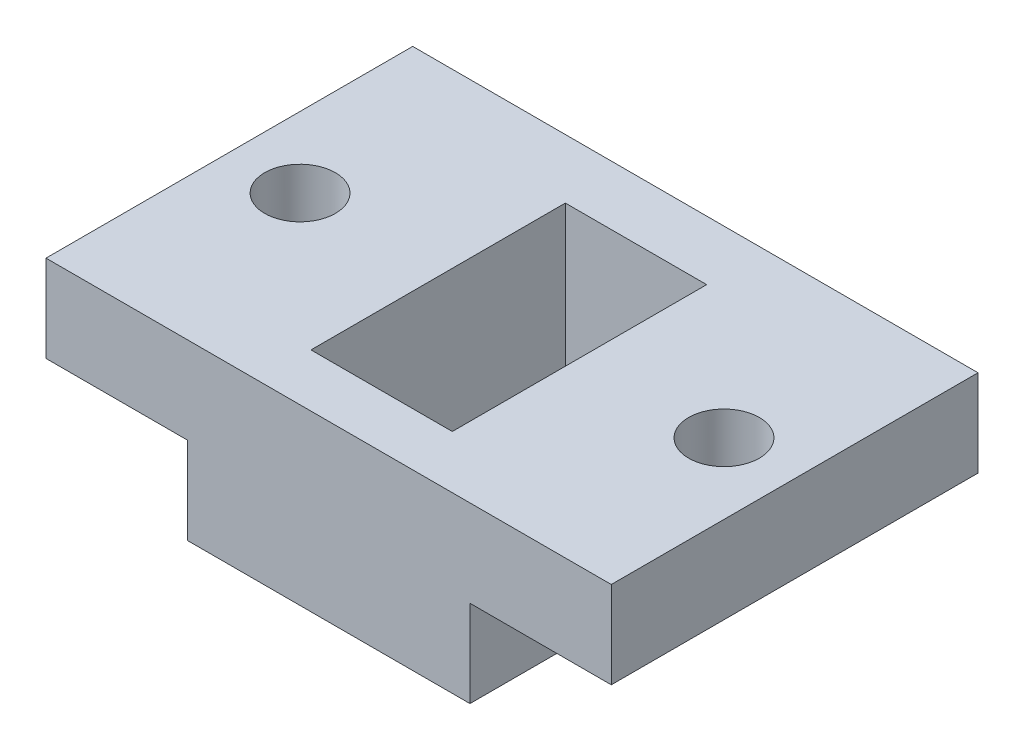
ISO-10303-21;
HEADER;
FILE_DESCRIPTION(('STEP AP214'),'2;1');
FILE_NAME('part.step','',(''),(''),'','','');
FILE_SCHEMA(('AUTOMOTIVE_DESIGN { 1 0 10303 214 1 1 1 1 }'));
ENDSEC;
DATA;
#1=APPLICATION_CONTEXT('core data for automotive mechanical design processes');
#2=APPLICATION_PROTOCOL_DEFINITION('international standard','automotive_design',2000,#1);
#3=PRODUCT_CONTEXT('',#1,'mechanical');
#4=PRODUCT('Part','Part','',(#3));
#5=PRODUCT_RELATED_PRODUCT_CATEGORY('part','',(#4));
#6=PRODUCT_DEFINITION_FORMATION('','',#4);
#7=PRODUCT_DEFINITION_CONTEXT('part definition',#1,'design');
#8=PRODUCT_DEFINITION('design','',#6,#7);
#9=PRODUCT_DEFINITION_SHAPE('','',#8);
#10=(LENGTH_UNIT() NAMED_UNIT(*) SI_UNIT(.MILLI.,.METRE.));
#11=(NAMED_UNIT(*) PLANE_ANGLE_UNIT() SI_UNIT($,.RADIAN.));
#12=(NAMED_UNIT(*) SI_UNIT($,.STERADIAN.) SOLID_ANGLE_UNIT());
#13=UNCERTAINTY_MEASURE_WITH_UNIT(LENGTH_MEASURE(1.E-05),#10,'distance_accuracy_value','');
#14=(GEOMETRIC_REPRESENTATION_CONTEXT(3) GLOBAL_UNCERTAINTY_ASSIGNED_CONTEXT((#13)) GLOBAL_UNIT_ASSIGNED_CONTEXT((#10,
#11,#12)) REPRESENTATION_CONTEXT('',''));
#15=CARTESIAN_POINT('',(0.,0.,0.));
#16=DIRECTION('',(0.,0.,1.));
#17=DIRECTION('',(1.,0.,0.));
#18=AXIS2_PLACEMENT_3D('',#15,#16,#17);
#19=CARTESIAN_POINT('',(12.7,7.8105,12.7));
#20=DIRECTION('',(-1.,0.,0.));
#21=DIRECTION('',(0.,-1.,0.));
#22=AXIS2_PLACEMENT_3D('',#19,#20,#21);
#23=PLANE('',#22);
#24=DIRECTION('',(0.,0.,-1.));
#25=VECTOR('',#24,1.);
#26=CARTESIAN_POINT('',(12.7,0.,4.7625));
#27=LINE('',#26,#25);
#28=CARTESIAN_POINT('',(12.7,0.,4.7625));
#29=VERTEX_POINT('',#28);
#30=CARTESIAN_POINT('',(12.7,0.,-28.194));
#31=VERTEX_POINT('',#30);
#32=EDGE_CURVE('E55',#29,#31,#27,.T.);
#33=ORIENTED_EDGE('',*,*,#32,.F.);
#34=DIRECTION('',(0.,1.,0.));
#35=VECTOR('',#34,1.);
#36=CARTESIAN_POINT('',(12.7,-7.9375,4.7625));
#37=LINE('',#36,#35);
#38=CARTESIAN_POINT('',(12.7,-7.8105,4.7625));
#39=VERTEX_POINT('',#38);
#40=EDGE_CURVE('E152',#39,#29,#37,.T.);
#41=ORIENTED_EDGE('',*,*,#40,.F.);
#42=DIRECTION('',(0.,0.,-1.));
#43=VECTOR('',#42,1.);
#44=CARTESIAN_POINT('',(12.7,-7.8105,12.7));
#45=LINE('',#44,#43);
#46=CARTESIAN_POINT('',(12.7,-7.8105,-28.194));
#47=VERTEX_POINT('',#46);
#48=EDGE_CURVE('E220',#39,#47,#45,.T.);
#49=ORIENTED_EDGE('',*,*,#48,.T.);
#50=DIRECTION('',(0.,-1.,0.));
#51=VECTOR('',#50,1.);
#52=CARTESIAN_POINT('',(12.7,7.8105,-28.194));
#53=LINE('',#52,#51);
#54=EDGE_CURVE('E176',#31,#47,#53,.T.);
#55=ORIENTED_EDGE('',*,*,#54,.F.);
#56=EDGE_LOOP('',(#33,#41,#49,#55));
#57=FACE_BOUND('',#56,.T.);
#58=ADVANCED_FACE('F41',(#57),#23,.F.);
#59=CARTESIAN_POINT('',(-12.7,7.8105,12.7));
#60=DIRECTION('',(1.,0.,0.));
#61=DIRECTION('',(0.,1.,0.));
#62=AXIS2_PLACEMENT_3D('',#59,#60,#61);
#63=PLANE('',#62);
#64=DIRECTION('',(0.,0.,1.));
#65=VECTOR('',#64,1.);
#66=CARTESIAN_POINT('',(-12.7,0.,-28.194));
#67=LINE('',#66,#65);
#68=CARTESIAN_POINT('',(-12.7,0.,-28.194));
#69=VERTEX_POINT('',#68);
#70=CARTESIAN_POINT('',(-12.7,0.,4.7625));
#71=VERTEX_POINT('',#70);
#72=EDGE_CURVE('E63',#69,#71,#67,.T.);
#73=ORIENTED_EDGE('',*,*,#72,.F.);
#74=DIRECTION('',(0.,1.,0.));
#75=VECTOR('',#74,1.);
#76=CARTESIAN_POINT('',(-12.7,7.8105,-28.194));
#77=LINE('',#76,#75);
#78=CARTESIAN_POINT('',(-12.7,-7.8105,-28.194));
#79=VERTEX_POINT('',#78);
#80=EDGE_CURVE('E182',#79,#69,#77,.T.);
#81=ORIENTED_EDGE('',*,*,#80,.F.);
#82=DIRECTION('',(0.,0.,-1.));
#83=VECTOR('',#82,1.);
#84=CARTESIAN_POINT('',(-12.7,-7.8105,12.7));
#85=LINE('',#84,#83);
#86=CARTESIAN_POINT('',(-12.7,-7.8105,4.7625));
#87=VERTEX_POINT('',#86);
#88=EDGE_CURVE('E48',#87,#79,#85,.T.);
#89=ORIENTED_EDGE('',*,*,#88,.F.);
#90=DIRECTION('',(0.,1.,0.));
#91=VECTOR('',#90,1.);
#92=CARTESIAN_POINT('',(-12.7,-7.9375,4.7625));
#93=LINE('',#92,#91);
#94=EDGE_CURVE('E192',#87,#71,#93,.T.);
#95=ORIENTED_EDGE('',*,*,#94,.T.);
#96=EDGE_LOOP('',(#73,#81,#89,#95));
#97=FACE_BOUND('',#96,.T.);
#98=ADVANCED_FACE('F231',(#97),#63,.F.);
#99=CARTESIAN_POINT('',(0.,0.,0.));
#100=DIRECTION('',(0.,0.,1.));
#101=DIRECTION('',(1.,0.,0.));
#102=AXIS2_PLACEMENT_3D('',#99,#100,#101);
#103=PLANE('',#102);
#104=DIRECTION('',(0.,1.,0.));
#105=VECTOR('',#104,1.);
#106=CARTESIAN_POINT('',(6.35,0.,0.));
#107=LINE('',#106,#105);
#108=CARTESIAN_POINT('',(6.35,-7.8105,0.));
#109=VERTEX_POINT('',#108);
#110=CARTESIAN_POINT('',(6.35,7.8105,0.));
#111=VERTEX_POINT('',#110);
#112=EDGE_CURVE('E194',#109,#111,#107,.T.);
#113=ORIENTED_EDGE('',*,*,#112,.F.);
#114=DIRECTION('',(1.,0.,0.));
#115=VECTOR('',#114,1.);
#116=CARTESIAN_POINT('',(-12.7,-7.8105,0.));
#117=LINE('',#116,#115);
#118=CARTESIAN_POINT('',(-6.35,-7.8105,0.));
#119=VERTEX_POINT('',#118);
#120=EDGE_CURVE('E217',#119,#109,#117,.T.);
#121=ORIENTED_EDGE('',*,*,#120,.F.);
#122=DIRECTION('',(0.,1.,0.));
#123=VECTOR('',#122,1.);
#124=CARTESIAN_POINT('',(-6.35,0.,0.));
#125=LINE('',#124,#123);
#126=CARTESIAN_POINT('',(-6.35,7.8105,0.));
#127=VERTEX_POINT('',#126);
#128=EDGE_CURVE('E205',#119,#127,#125,.T.);
#129=ORIENTED_EDGE('',*,*,#128,.T.);
#130=DIRECTION('',(-1.,0.,0.));
#131=VECTOR('',#130,1.);
#132=CARTESIAN_POINT('',(-12.7,7.8105,0.));
#133=LINE('',#132,#131);
#134=EDGE_CURVE('E215',#111,#127,#133,.T.);
#135=ORIENTED_EDGE('',*,*,#134,.F.);
#136=EDGE_LOOP('',(#113,#121,#129,#135));
#137=FACE_BOUND('',#136,.T.);
#138=ADVANCED_FACE('F233',(#137),#103,.F.);
#139=CARTESIAN_POINT('',(-12.7,7.8105,12.7));
#140=DIRECTION('',(0.,-1.,0.));
#141=DIRECTION('',(0.,0.,-1.));
#142=AXIS2_PLACEMENT_3D('',#139,#140,#141);
#143=PLANE('',#142);
#144=CARTESIAN_POINT('',(-19.05,7.8105,-11.71575));
#145=DIRECTION('',(0.,-1.,0.));
#146=DIRECTION('',(0.,0.,-1.));
#147=AXIS2_PLACEMENT_3D('',#144,#145,#146);
#148=CIRCLE('',#147,3.175);
#149=CARTESIAN_POINT('',(-19.05,7.8105,-14.89075));
#150=VERTEX_POINT('',#149);
#151=EDGE_CURVE('E256',#150,#150,#148,.T.);
#152=ORIENTED_EDGE('',*,*,#151,.T.);
#153=EDGE_LOOP('',(#152));
#154=FACE_BOUND('',#153,.T.);
#155=CARTESIAN_POINT('',(19.05,7.8105,-11.71575));
#156=DIRECTION('',(0.,-1.,0.));
#157=DIRECTION('',(0.,0.,-1.));
#158=AXIS2_PLACEMENT_3D('',#155,#156,#157);
#159=CIRCLE('',#158,3.175);
#160=CARTESIAN_POINT('',(19.05,7.8105,-14.89075));
#161=VERTEX_POINT('',#160);
#162=EDGE_CURVE('E260',#161,#161,#159,.T.);
#163=ORIENTED_EDGE('',*,*,#162,.T.);
#164=EDGE_LOOP('',(#163));
#165=FACE_BOUND('',#164,.T.);
#166=DIRECTION('',(0.,0.,1.));
#167=VECTOR('',#166,1.);
#168=CARTESIAN_POINT('',(-6.35,7.8105,-22.86));
#169=LINE('',#168,#167);
#170=CARTESIAN_POINT('',(-6.35,7.8105,-22.86));
#171=VERTEX_POINT('',#170);
#172=EDGE_CURVE('E208',#171,#127,#169,.T.);
#173=ORIENTED_EDGE('',*,*,#172,.F.);
#174=DIRECTION('',(1.,0.,0.));
#175=VECTOR('',#174,1.);
#176=CARTESIAN_POINT('',(12.7,7.8105,-22.86));
#177=LINE('',#176,#175);
#178=CARTESIAN_POINT('',(6.35,7.8105,-22.86));
#179=VERTEX_POINT('',#178);
#180=EDGE_CURVE('E179',#171,#179,#177,.T.);
#181=ORIENTED_EDGE('',*,*,#180,.T.);
#182=DIRECTION('',(0.,0.,1.));
#183=VECTOR('',#182,1.);
#184=CARTESIAN_POINT('',(6.35,7.8105,-22.86));
#185=LINE('',#184,#183);
#186=EDGE_CURVE('E199',#179,#111,#185,.T.);
#187=ORIENTED_EDGE('',*,*,#186,.T.);
#188=ORIENTED_EDGE('',*,*,#134,.T.);
#189=EDGE_LOOP('',(#173,#181,#187,#188));
#190=FACE_BOUND('',#189,.T.);
#191=DIRECTION('',(1.,0.,0.));
#192=VECTOR('',#191,1.);
#193=CARTESIAN_POINT('',(12.7,7.8105,-28.194));
#194=LINE('',#193,#192);
#195=CARTESIAN_POINT('',(-25.4,7.8105,-28.194));
#196=VERTEX_POINT('',#195);
#197=CARTESIAN_POINT('',(25.4,7.8105,-28.194));
#198=VERTEX_POINT('',#197);
#199=EDGE_CURVE('E184',#196,#198,#194,.T.);
#200=ORIENTED_EDGE('',*,*,#199,.F.);
#201=DIRECTION('',(0.,0.,-1.));
#202=VECTOR('',#201,1.);
#203=CARTESIAN_POINT('',(-25.4,7.8105,-28.194));
#204=LINE('',#203,#202);
#205=CARTESIAN_POINT('',(-25.4,7.8105,4.7625));
#206=VERTEX_POINT('',#205);
#207=EDGE_CURVE('E166',#206,#196,#204,.T.);
#208=ORIENTED_EDGE('',*,*,#207,.F.);
#209=DIRECTION('',(-1.,0.,0.));
#210=VECTOR('',#209,1.);
#211=CARTESIAN_POINT('',(-12.7,7.8105,4.7625));
#212=LINE('',#211,#210);
#213=CARTESIAN_POINT('',(25.4,7.8105,4.7625));
#214=VERTEX_POINT('',#213);
#215=EDGE_CURVE('E186',#214,#206,#212,.T.);
#216=ORIENTED_EDGE('',*,*,#215,.F.);
#217=DIRECTION('',(0.,0.,1.));
#218=VECTOR('',#217,1.);
#219=CARTESIAN_POINT('',(25.4,7.8105,4.7625));
#220=LINE('',#219,#218);
#221=EDGE_CURVE('E148',#198,#214,#220,.T.);
#222=ORIENTED_EDGE('',*,*,#221,.F.);
#223=EDGE_LOOP('',(#200,#208,#216,#222));
#224=FACE_BOUND('',#223,.T.);
#225=ADVANCED_FACE('F240',(#154,#165,#190,#224),#143,.F.);
#226=CARTESIAN_POINT('',(-12.7,-7.8105,12.7));
#227=DIRECTION('',(0.,1.,0.));
#228=DIRECTION('',(0.,0.,1.));
#229=AXIS2_PLACEMENT_3D('',#226,#227,#228);
#230=PLANE('',#229);
#231=ORIENTED_EDGE('',*,*,#88,.T.);
#232=DIRECTION('',(-1.,0.,0.));
#233=VECTOR('',#232,1.);
#234=CARTESIAN_POINT('',(12.7,-7.8105,-28.194));
#235=LINE('',#234,#233);
#236=EDGE_CURVE('E178',#47,#79,#235,.T.);
#237=ORIENTED_EDGE('',*,*,#236,.F.);
#238=ORIENTED_EDGE('',*,*,#48,.F.);
#239=DIRECTION('',(-1.,0.,0.));
#240=VECTOR('',#239,1.);
#241=CARTESIAN_POINT('',(-12.7,-7.8105,4.7625));
#242=LINE('',#241,#240);
#243=EDGE_CURVE('E11',#39,#87,#242,.T.);
#244=ORIENTED_EDGE('',*,*,#243,.T.);
#245=EDGE_LOOP('',(#231,#237,#238,#244));
#246=FACE_BOUND('',#245,.T.);
#247=DIRECTION('',(-1.,0.,0.));
#248=VECTOR('',#247,1.);
#249=CARTESIAN_POINT('',(12.7,-7.8105,-22.86));
#250=LINE('',#249,#248);
#251=CARTESIAN_POINT('',(6.35,-7.8105,-22.86));
#252=VERTEX_POINT('',#251);
#253=CARTESIAN_POINT('',(-6.35,-7.8105,-22.86));
#254=VERTEX_POINT('',#253);
#255=EDGE_CURVE('E175',#252,#254,#250,.T.);
#256=ORIENTED_EDGE('',*,*,#255,.T.);
#257=DIRECTION('',(0.,0.,1.));
#258=VECTOR('',#257,1.);
#259=CARTESIAN_POINT('',(-6.35,-7.8105,-22.86));
#260=LINE('',#259,#258);
#261=EDGE_CURVE('E213',#254,#119,#260,.T.);
#262=ORIENTED_EDGE('',*,*,#261,.T.);
#263=ORIENTED_EDGE('',*,*,#120,.T.);
#264=DIRECTION('',(0.,0.,1.));
#265=VECTOR('',#264,1.);
#266=CARTESIAN_POINT('',(6.35,-7.8105,-22.86));
#267=LINE('',#266,#265);
#268=EDGE_CURVE('E203',#252,#109,#267,.T.);
#269=ORIENTED_EDGE('',*,*,#268,.F.);
#270=EDGE_LOOP('',(#256,#262,#263,#269));
#271=FACE_BOUND('',#270,.T.);
#272=ADVANCED_FACE('F225',(#246,#271),#230,.F.);
#273=CARTESIAN_POINT('',(-6.35,0.,-22.86));
#274=DIRECTION('',(1.,0.,0.));
#275=DIRECTION('',(0.,0.,-1.));
#276=AXIS2_PLACEMENT_3D('',#273,#274,#275);
#277=PLANE('',#276);
#278=ORIENTED_EDGE('',*,*,#128,.F.);
#279=ORIENTED_EDGE('',*,*,#261,.F.);
#280=DIRECTION('',(0.,1.,0.));
#281=VECTOR('',#280,1.);
#282=CARTESIAN_POINT('',(-6.35,0.,-22.86));
#283=LINE('',#282,#281);
#284=EDGE_CURVE('E206',#254,#171,#283,.T.);
#285=ORIENTED_EDGE('',*,*,#284,.T.);
#286=ORIENTED_EDGE('',*,*,#172,.T.);
#287=EDGE_LOOP('',(#278,#279,#285,#286));
#288=FACE_BOUND('',#287,.T.);
#289=ADVANCED_FACE('F252',(#288),#277,.T.);
#290=CARTESIAN_POINT('',(6.35,0.,-22.86));
#291=DIRECTION('',(1.,0.,0.));
#292=DIRECTION('',(0.,0.,-1.));
#293=AXIS2_PLACEMENT_3D('',#290,#291,#292);
#294=PLANE('',#293);
#295=ORIENTED_EDGE('',*,*,#112,.T.);
#296=ORIENTED_EDGE('',*,*,#186,.F.);
#297=DIRECTION('',(0.,1.,0.));
#298=VECTOR('',#297,1.);
#299=CARTESIAN_POINT('',(6.35,0.,-22.86));
#300=LINE('',#299,#298);
#301=EDGE_CURVE('E196',#252,#179,#300,.T.);
#302=ORIENTED_EDGE('',*,*,#301,.F.);
#303=ORIENTED_EDGE('',*,*,#268,.T.);
#304=EDGE_LOOP('',(#295,#296,#302,#303));
#305=FACE_BOUND('',#304,.T.);
#306=ADVANCED_FACE('F301',(#305),#294,.F.);
#307=CARTESIAN_POINT('',(-12.7,-7.9375,4.7625));
#308=DIRECTION('',(0.,0.,-1.));
#309=DIRECTION('',(-1.,0.,0.));
#310=AXIS2_PLACEMENT_3D('',#307,#308,#309);
#311=PLANE('',#310);
#312=ORIENTED_EDGE('',*,*,#40,.T.);
#313=DIRECTION('',(-1.,0.,0.));
#314=VECTOR('',#313,1.);
#315=CARTESIAN_POINT('',(25.4,0.,4.7625));
#316=LINE('',#315,#314);
#317=CARTESIAN_POINT('',(25.4,0.,4.7625));
#318=VERTEX_POINT('',#317);
#319=EDGE_CURVE('E135',#318,#29,#316,.T.);
#320=ORIENTED_EDGE('',*,*,#319,.F.);
#321=DIRECTION('',(0.,-1.,0.));
#322=VECTOR('',#321,1.);
#323=CARTESIAN_POINT('',(25.4,7.8105,4.7625));
#324=LINE('',#323,#322);
#325=EDGE_CURVE('E142',#214,#318,#324,.T.);
#326=ORIENTED_EDGE('',*,*,#325,.F.);
#327=ORIENTED_EDGE('',*,*,#215,.T.);
#328=DIRECTION('',(0.,1.,0.));
#329=VECTOR('',#328,1.);
#330=CARTESIAN_POINT('',(-25.4,7.8105,4.7625));
#331=LINE('',#330,#329);
#332=CARTESIAN_POINT('',(-25.4,0.,4.7625));
#333=VERTEX_POINT('',#332);
#334=EDGE_CURVE('E163',#333,#206,#331,.T.);
#335=ORIENTED_EDGE('',*,*,#334,.F.);
#336=DIRECTION('',(1.,0.,0.));
#337=VECTOR('',#336,1.);
#338=CARTESIAN_POINT('',(-25.4,0.,4.7625));
#339=LINE('',#338,#337);
#340=EDGE_CURVE('E168',#333,#71,#339,.T.);
#341=ORIENTED_EDGE('',*,*,#340,.T.);
#342=ORIENTED_EDGE('',*,*,#94,.F.);
#343=ORIENTED_EDGE('',*,*,#243,.F.);
#344=EDGE_LOOP('',(#312,#320,#326,#327,#335,#341,#342,#343));
#345=FACE_BOUND('',#344,.T.);
#346=ADVANCED_FACE('F151',(#345),#311,.F.);
#347=CARTESIAN_POINT('',(0.,0.,-22.86));
#348=DIRECTION('',(0.,0.,-1.));
#349=DIRECTION('',(-1.,0.,0.));
#350=AXIS2_PLACEMENT_3D('',#347,#348,#349);
#351=PLANE('',#350);
#352=ORIENTED_EDGE('',*,*,#284,.F.);
#353=ORIENTED_EDGE('',*,*,#255,.F.);
#354=ORIENTED_EDGE('',*,*,#301,.T.);
#355=ORIENTED_EDGE('',*,*,#180,.F.);
#356=EDGE_LOOP('',(#352,#353,#354,#355));
#357=FACE_BOUND('',#356,.T.);
#358=ADVANCED_FACE('F293',(#357),#351,.F.);
#359=CARTESIAN_POINT('',(0.,0.,-28.194));
#360=DIRECTION('',(0.,0.,-1.));
#361=DIRECTION('',(-1.,0.,0.));
#362=AXIS2_PLACEMENT_3D('',#359,#360,#361);
#363=PLANE('',#362);
#364=ORIENTED_EDGE('',*,*,#199,.T.);
#365=DIRECTION('',(0.,1.,0.));
#366=VECTOR('',#365,1.);
#367=CARTESIAN_POINT('',(25.4,7.8105,-28.194));
#368=LINE('',#367,#366);
#369=CARTESIAN_POINT('',(25.4,0.,-28.194));
#370=VERTEX_POINT('',#369);
#371=EDGE_CURVE('E141',#370,#198,#368,.T.);
#372=ORIENTED_EDGE('',*,*,#371,.F.);
#373=DIRECTION('',(-1.,0.,0.));
#374=VECTOR('',#373,1.);
#375=CARTESIAN_POINT('',(25.4,0.,-28.194));
#376=LINE('',#375,#374);
#377=EDGE_CURVE('E137',#370,#31,#376,.T.);
#378=ORIENTED_EDGE('',*,*,#377,.T.);
#379=ORIENTED_EDGE('',*,*,#54,.T.);
#380=ORIENTED_EDGE('',*,*,#236,.T.);
#381=ORIENTED_EDGE('',*,*,#80,.T.);
#382=DIRECTION('',(1.,0.,0.));
#383=VECTOR('',#382,1.);
#384=CARTESIAN_POINT('',(-25.4,0.,-28.194));
#385=LINE('',#384,#383);
#386=CARTESIAN_POINT('',(-25.4,0.,-28.194));
#387=VERTEX_POINT('',#386);
#388=EDGE_CURVE('E172',#387,#69,#385,.T.);
#389=ORIENTED_EDGE('',*,*,#388,.F.);
#390=DIRECTION('',(0.,-1.,0.));
#391=VECTOR('',#390,1.);
#392=CARTESIAN_POINT('',(-25.4,7.8105,-28.194));
#393=LINE('',#392,#391);
#394=EDGE_CURVE('E154',#196,#387,#393,.T.);
#395=ORIENTED_EDGE('',*,*,#394,.F.);
#396=EDGE_LOOP('',(#364,#372,#378,#379,#380,#381,#389,#395));
#397=FACE_BOUND('',#396,.T.);
#398=ADVANCED_FACE('F229',(#397),#363,.T.);
#399=CARTESIAN_POINT('',(-25.4,0.,-28.194));
#400=DIRECTION('',(0.,1.,0.));
#401=DIRECTION('',(-1.,0.,0.));
#402=AXIS2_PLACEMENT_3D('',#399,#400,#401);
#403=PLANE('',#402);
#404=CARTESIAN_POINT('',(-19.05,0.,-11.71575));
#405=DIRECTION('',(0.,-1.,0.));
#406=DIRECTION('',(1.,0.,0.));
#407=AXIS2_PLACEMENT_3D('',#404,#405,#406);
#408=CIRCLE('',#407,3.175);
#409=CARTESIAN_POINT('',(-15.875,0.,-11.71575));
#410=VERTEX_POINT('',#409);
#411=EDGE_CURVE('E277',#410,#410,#408,.T.);
#412=ORIENTED_EDGE('',*,*,#411,.F.);
#413=EDGE_LOOP('',(#412));
#414=FACE_BOUND('',#413,.T.);
#415=ORIENTED_EDGE('',*,*,#72,.T.);
#416=ORIENTED_EDGE('',*,*,#340,.F.);
#417=DIRECTION('',(0.,0.,1.));
#418=VECTOR('',#417,1.);
#419=CARTESIAN_POINT('',(-25.4,0.,-28.194));
#420=LINE('',#419,#418);
#421=EDGE_CURVE('E161',#387,#333,#420,.T.);
#422=ORIENTED_EDGE('',*,*,#421,.F.);
#423=ORIENTED_EDGE('',*,*,#388,.T.);
#424=EDGE_LOOP('',(#415,#416,#422,#423));
#425=FACE_BOUND('',#424,.T.);
#426=ADVANCED_FACE('F270',(#414,#425),#403,.F.);
#427=CARTESIAN_POINT('',(-25.4,0.,0.));
#428=DIRECTION('',(-1.,0.,0.));
#429=DIRECTION('',(0.,-1.,0.));
#430=AXIS2_PLACEMENT_3D('',#427,#428,#429);
#431=PLANE('',#430);
#432=ORIENTED_EDGE('',*,*,#394,.T.);
#433=ORIENTED_EDGE('',*,*,#421,.T.);
#434=ORIENTED_EDGE('',*,*,#334,.T.);
#435=ORIENTED_EDGE('',*,*,#207,.T.);
#436=EDGE_LOOP('',(#432,#433,#434,#435));
#437=FACE_BOUND('',#436,.T.);
#438=ADVANCED_FACE('F267',(#437),#431,.T.);
#439=CARTESIAN_POINT('',(25.4,0.,4.7625));
#440=DIRECTION('',(0.,1.,0.));
#441=DIRECTION('',(-1.,0.,0.));
#442=AXIS2_PLACEMENT_3D('',#439,#440,#441);
#443=PLANE('',#442);
#444=CARTESIAN_POINT('',(19.05,0.,-11.71575));
#445=DIRECTION('',(0.,-1.,0.));
#446=DIRECTION('',(1.,0.,0.));
#447=AXIS2_PLACEMENT_3D('',#444,#445,#446);
#448=CIRCLE('',#447,3.175);
#449=CARTESIAN_POINT('',(22.225,0.,-11.71575));
#450=VERTEX_POINT('',#449);
#451=EDGE_CURVE('E278',#450,#450,#448,.T.);
#452=ORIENTED_EDGE('',*,*,#451,.F.);
#453=EDGE_LOOP('',(#452));
#454=FACE_BOUND('',#453,.T.);
#455=ORIENTED_EDGE('',*,*,#32,.T.);
#456=ORIENTED_EDGE('',*,*,#377,.F.);
#457=DIRECTION('',(0.,0.,-1.));
#458=VECTOR('',#457,1.);
#459=CARTESIAN_POINT('',(25.4,0.,4.7625));
#460=LINE('',#459,#458);
#461=EDGE_CURVE('E131',#318,#370,#460,.T.);
#462=ORIENTED_EDGE('',*,*,#461,.F.);
#463=ORIENTED_EDGE('',*,*,#319,.T.);
#464=EDGE_LOOP('',(#455,#456,#462,#463));
#465=FACE_BOUND('',#464,.T.);
#466=ADVANCED_FACE('F133',(#454,#465),#443,.F.);
#467=CARTESIAN_POINT('',(25.4,0.,0.));
#468=DIRECTION('',(1.,0.,0.));
#469=DIRECTION('',(0.,1.,0.));
#470=AXIS2_PLACEMENT_3D('',#467,#468,#469);
#471=PLANE('',#470);
#472=ORIENTED_EDGE('',*,*,#325,.T.);
#473=ORIENTED_EDGE('',*,*,#461,.T.);
#474=ORIENTED_EDGE('',*,*,#371,.T.);
#475=ORIENTED_EDGE('',*,*,#221,.T.);
#476=EDGE_LOOP('',(#472,#473,#474,#475));
#477=FACE_BOUND('',#476,.T.);
#478=ADVANCED_FACE('F146',(#477),#471,.T.);
#479=CARTESIAN_POINT('',(19.05,12.7,-11.71575));
#480=DIRECTION('',(0.,-1.,0.));
#481=DIRECTION('',(1.,0.,0.));
#482=AXIS2_PLACEMENT_3D('',#479,#480,#481);
#483=CYLINDRICAL_SURFACE('',#482,3.175);
#484=ORIENTED_EDGE('',*,*,#451,.T.);
#485=EDGE_LOOP('',(#484));
#486=FACE_BOUND('',#485,.T.);
#487=ORIENTED_EDGE('',*,*,#162,.F.);
#488=EDGE_LOOP('',(#487));
#489=FACE_BOUND('',#488,.T.);
#490=ADVANCED_FACE('F396',(#486,#489),#483,.F.);
#491=CARTESIAN_POINT('',(-19.05,12.7,-11.71575));
#492=DIRECTION('',(0.,-1.,0.));
#493=DIRECTION('',(1.,0.,0.));
#494=AXIS2_PLACEMENT_3D('',#491,#492,#493);
#495=CYLINDRICAL_SURFACE('',#494,3.175);
#496=ORIENTED_EDGE('',*,*,#411,.T.);
#497=EDGE_LOOP('',(#496));
#498=FACE_BOUND('',#497,.T.);
#499=ORIENTED_EDGE('',*,*,#151,.F.);
#500=EDGE_LOOP('',(#499));
#501=FACE_BOUND('',#500,.T.);
#502=ADVANCED_FACE('F284',(#498,#501),#495,.F.);
#503=CLOSED_SHELL('',(#58,#98,#138,#225,#272,#289,#306,#346,#358,#398,#426,#438,#466,#478,#490,#502));
#504=MANIFOLD_SOLID_BREP('B2',#503);
#505=ADVANCED_BREP_SHAPE_REPRESENTATION('',(#18,#504),#14);
#506=SHAPE_DEFINITION_REPRESENTATION(#9,#505);
ENDSEC;
END-ISO-10303-21;
